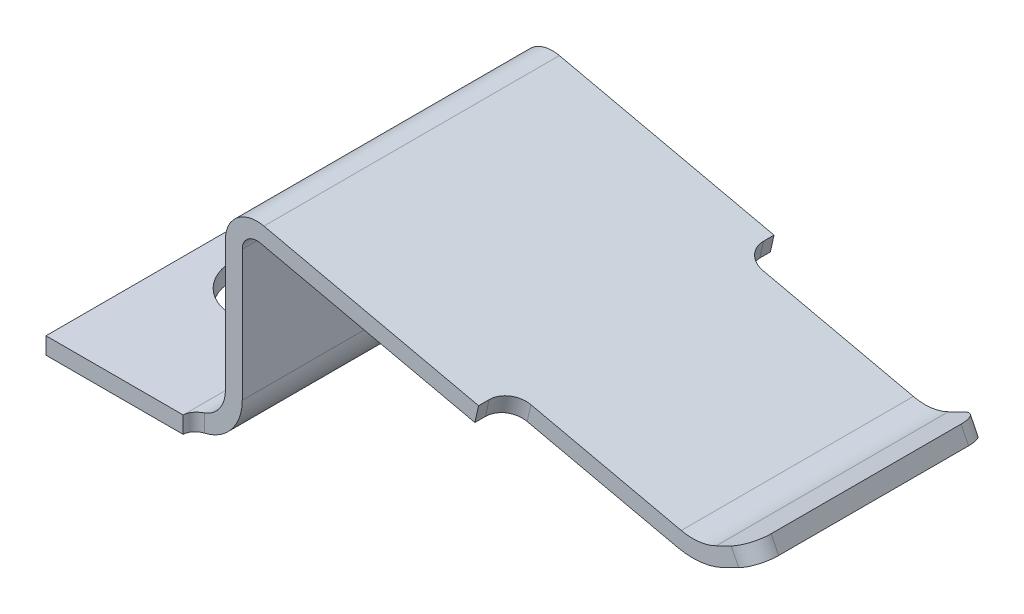
ISO-10303-21;
HEADER;
FILE_DESCRIPTION(('STEP AP214'),'2;1');
FILE_NAME('part.step','',(''),(''),'','','');
FILE_SCHEMA(('AUTOMOTIVE_DESIGN { 1 0 10303 214 1 1 1 1 }'));
ENDSEC;
DATA;
#1=APPLICATION_CONTEXT('core data for automotive mechanical design processes');
#2=APPLICATION_PROTOCOL_DEFINITION('international standard','automotive_design',2000,#1);
#3=PRODUCT_CONTEXT('',#1,'mechanical');
#4=PRODUCT('Part','Part','',(#3));
#5=PRODUCT_RELATED_PRODUCT_CATEGORY('part','',(#4));
#6=PRODUCT_DEFINITION_FORMATION('','',#4);
#7=PRODUCT_DEFINITION_CONTEXT('part definition',#1,'design');
#8=PRODUCT_DEFINITION('design','',#6,#7);
#9=PRODUCT_DEFINITION_SHAPE('','',#8);
#10=(LENGTH_UNIT() NAMED_UNIT(*) SI_UNIT(.MILLI.,.METRE.));
#11=(NAMED_UNIT(*) PLANE_ANGLE_UNIT() SI_UNIT($,.RADIAN.));
#12=(NAMED_UNIT(*) SI_UNIT($,.STERADIAN.) SOLID_ANGLE_UNIT());
#13=UNCERTAINTY_MEASURE_WITH_UNIT(LENGTH_MEASURE(1.E-05),#10,'distance_accuracy_value','');
#14=(GEOMETRIC_REPRESENTATION_CONTEXT(3) GLOBAL_UNCERTAINTY_ASSIGNED_CONTEXT((#13)) GLOBAL_UNIT_ASSIGNED_CONTEXT((#10,
#11,#12)) REPRESENTATION_CONTEXT('',''));
#15=CARTESIAN_POINT('',(0.,0.,0.));
#16=DIRECTION('',(0.,0.,1.));
#17=DIRECTION('',(1.,0.,0.));
#18=AXIS2_PLACEMENT_3D('',#15,#16,#17);
#19=CARTESIAN_POINT('',(-26.7290603518756,2.35941200013767,15.));
#20=DIRECTION('',(0.,0.,-1.));
#21=DIRECTION('',(-1.,0.,0.));
#22=AXIS2_PLACEMENT_3D('',#19,#20,#21);
#23=CYLINDRICAL_SURFACE('',#22,2.3);
#24=CARTESIAN_POINT('',(-26.7290603518756,2.35941200013767,14.5));
#25=DIRECTION('',(0.,0.,1.));
#26=DIRECTION('',(1.,0.,0.));
#27=AXIS2_PLACEMENT_3D('',#24,#25,#26);
#28=CIRCLE('',#27,2.3);
#29=CARTESIAN_POINT('',(-26.2290603518756,0.114417568073306,14.5));
#30=VERTEX_POINT('',#29);
#31=CARTESIAN_POINT('',(-24.4290603518756,2.35941200013769,14.5));
#32=VERTEX_POINT('',#31);
#33=EDGE_CURVE('E365',#30,#32,#28,.T.);
#34=ORIENTED_EDGE('',*,*,#33,.F.);
#35=CARTESIAN_POINT('',(-26.2290603518756,0.114417568073306,14.5));
#36=CARTESIAN_POINT('',(-26.2564473629787,0.108297891617995,14.499972232805));
#37=CARTESIAN_POINT('',(-26.2839607838795,0.10271583665332,14.5022492868127));
#38=CARTESIAN_POINT('',(-26.3384242806716,0.0926641254696684,14.5113343569761));
#39=CARTESIAN_POINT('',(-26.3653745851965,0.0881940094191474,14.5181404958789));
#40=CARTESIAN_POINT('',(-26.4179516690694,0.0803934619622615,14.5362161489702));
#41=CARTESIAN_POINT('',(-26.4435767983767,0.0770644236713034,14.5474910830679));
#42=CARTESIAN_POINT('',(-26.4926618015783,0.0714599061475847,14.5742132503489));
#43=CARTESIAN_POINT('',(-26.5161225799144,0.0691839852254791,14.5896587300463));
#44=CARTESIAN_POINT('',(-26.5598998306519,0.0655369479320075,14.6240858466973));
#45=CARTESIAN_POINT('',(-26.5802511168163,0.06415514980875,14.6430221270828));
#46=CARTESIAN_POINT('',(-26.6175574806604,0.0620402340923808,14.6840277856892));
#47=CARTESIAN_POINT('',(-26.6345115828421,0.0613073026147476,14.7060980607337));
#48=CARTESIAN_POINT('',(-26.6646099369819,0.0602654238021907,14.7528680668783));
#49=CARTESIAN_POINT('',(-26.6777339629093,0.059958696279143,14.7775808480982));
#50=CARTESIAN_POINT('',(-26.6996791714534,0.0595733693225185,14.8288439650459));
#51=CARTESIAN_POINT('',(-26.7085023777762,0.0594946625098046,14.8553934298126));
#52=CARTESIAN_POINT('',(-26.7197042817381,0.0594262458496021,14.9017114471902));
#53=CARTESIAN_POINT('',(-26.7232095864458,0.0594173548966498,14.9212153964667));
#54=CARTESIAN_POINT('',(-26.7278881134391,0.0594120054497062,14.9604770225969));
#55=CARTESIAN_POINT('',(-26.7290641463149,0.0594155319580244,14.980234364674));
#56=CARTESIAN_POINT('',(-26.7290603518756,0.0594120001376731,15.));
#57=B_SPLINE_CURVE_WITH_KNOTS('',3,(#35,#36,#37,#38,#39,#40,#41,#42,#43,#44,#45,#46,#47,#48,#49,
#50,#51,#52,#53,#54,#55,#56),.UNSPECIFIED.,.F.,.F.,(4,2,2,2,2,2,2,2,2,2,4),(0.,
0.0840988131780822,0.168162790073163,0.252329036190885,0.336459949964444,0.419566261057631,
0.502696401953614,0.586257909667654,0.669780060332771,0.729097682258264,0.788343685516884),.UNSPECIFIED.);
#58=CARTESIAN_POINT('',(-26.7290603518756,0.0594120001376729,15.));
#59=VERTEX_POINT('',#58);
#60=EDGE_CURVE('E256',#30,#59,#57,.T.);
#61=ORIENTED_EDGE('',*,*,#60,.T.);
#62=DIRECTION('',(0.,0.,-1.));
#63=VECTOR('',#62,1.);
#64=CARTESIAN_POINT('',(-26.7290603518756,0.0594120001376729,15.));
#65=LINE('',#64,#63);
#66=CARTESIAN_POINT('',(-26.7290603518756,0.0594120001376729,0.));
#67=VERTEX_POINT('',#66);
#68=EDGE_CURVE('E371',#59,#67,#65,.T.);
#69=ORIENTED_EDGE('',*,*,#68,.T.);
#70=CARTESIAN_POINT('',(-26.7290603518756,0.0594120001376729,0.));
#71=CARTESIAN_POINT('',(-26.7290842261194,0.0594266757004995,0.0281159383814194));
#72=CARTESIAN_POINT('',(-26.7266902568834,0.0594122466698722,0.056224881344144));
#73=CARTESIAN_POINT('',(-26.7172423187382,0.0594336371370751,0.111629111052852));
#74=CARTESIAN_POINT('',(-26.7101916202269,0.0594694213901872,0.138924954784363));
#75=CARTESIAN_POINT('',(-26.6916007534505,0.0596994707641535,0.19195838009901));
#76=CARTESIAN_POINT('',(-26.6800583139606,0.0598938161151774,0.217695165732216));
#77=CARTESIAN_POINT('',(-26.6528233691602,0.0606353695839836,0.266859505242131));
#78=CARTESIAN_POINT('',(-26.6371315669505,0.0611825179426022,0.290287449424877));
#79=CARTESIAN_POINT('',(-26.6020853240555,0.0628530076508338,0.334123271950187));
#80=CARTESIAN_POINT('',(-26.5827381969639,0.0639752059853017,0.354537038216604));
#81=CARTESIAN_POINT('',(-26.5409342512026,0.0670231258118374,0.391814672109207));
#82=CARTESIAN_POINT('',(-26.5184774356497,0.0689488464985527,0.408678543293349));
#83=CARTESIAN_POINT('',(-26.4713331946477,0.0737757534642002,0.438260573713225));
#84=CARTESIAN_POINT('',(-26.4466651923218,0.076668958005787,0.451011030229623));
#85=CARTESIAN_POINT('',(-26.3956931207944,0.083554743712414,0.472223208746983));
#86=CARTESIAN_POINT('',(-26.3693894827819,0.0875470360772381,0.480686055718539));
#87=CARTESIAN_POINT('',(-26.3239596712388,0.0952886684237955,0.491288398125929));
#88=CARTESIAN_POINT('',(-26.3050403506204,0.0987533994830042,0.494562186691906));
#89=CARTESIAN_POINT('',(-26.2670837089133,0.106201979117094,0.498918177314107));
#90=CARTESIAN_POINT('',(-26.2480466261751,0.110184984921513,0.500003891154771));
#91=CARTESIAN_POINT('',(-26.2290603518756,0.114417568073306,0.5));
#92=B_SPLINE_CURVE_WITH_KNOTS('',3,(#70,#71,#72,#73,#74,#75,#76,#77,#78,#79,#80,#81,#82,#83,#84,
#85,#86,#87,#88,#89,#90,#91),.UNSPECIFIED.,.F.,.F.,(4,2,2,2,2,2,2,2,2,2,4),(0.,
0.0842361075468874,0.1684131193119,0.25263275015259,0.336838119286433,0.420876760627213,
0.504915317738136,0.588276993082385,0.671616784889454,0.73002489537111,0.788339187956234),.UNSPECIFIED.);
#93=CARTESIAN_POINT('',(-26.2290603518756,0.114417568073306,0.5));
#94=VERTEX_POINT('',#93);
#95=EDGE_CURVE('E289',#67,#94,#92,.T.);
#96=ORIENTED_EDGE('',*,*,#95,.T.);
#97=CARTESIAN_POINT('',(-26.7290603518756,2.35941200013767,0.5));
#98=DIRECTION('',(0.,0.,-1.));
#99=DIRECTION('',(-1.,0.,0.));
#100=AXIS2_PLACEMENT_3D('',#97,#98,#99);
#101=CIRCLE('',#100,2.3);
#102=CARTESIAN_POINT('',(-24.4290603518756,2.35941200013769,0.5));
#103=VERTEX_POINT('',#102);
#104=EDGE_CURVE('E370',#103,#94,#101,.T.);
#105=ORIENTED_EDGE('',*,*,#104,.F.);
#106=DIRECTION('',(0.,0.,-1.));
#107=VECTOR('',#106,1.);
#108=CARTESIAN_POINT('',(-24.4290603518756,2.35941200013769,15.));
#109=LINE('',#108,#107);
#110=EDGE_CURVE('E360',#32,#103,#109,.T.);
#111=ORIENTED_EDGE('',*,*,#110,.F.);
#112=EDGE_LOOP('',(#34,#61,#69,#96,#105,#111));
#113=FACE_BOUND('',#112,.T.);
#114=ADVANCED_FACE('F33',(#113),#23,.T.);
#115=CARTESIAN_POINT('',(-24.4290603518756,2.35941200013769,15.));
#116=DIRECTION('',(-1.,0.,0.));
#117=DIRECTION('',(0.,0.,1.));
#118=AXIS2_PLACEMENT_3D('',#115,#116,#117);
#119=PLANE('',#118);
#120=DIRECTION('',(0.,1.,0.));
#121=VECTOR('',#120,1.);
#122=CARTESIAN_POINT('',(-24.4290603518756,2.35941200013769,14.5));
#123=LINE('',#122,#121);
#124=CARTESIAN_POINT('',(-24.4290603518756,8.55941200013767,14.5));
#125=VERTEX_POINT('',#124);
#126=EDGE_CURVE('E357',#32,#125,#123,.T.);
#127=ORIENTED_EDGE('',*,*,#126,.F.);
#128=ORIENTED_EDGE('',*,*,#110,.T.);
#129=DIRECTION('',(0.,-1.,0.));
#130=VECTOR('',#129,1.);
#131=CARTESIAN_POINT('',(-24.4290603518756,2.35941200013769,0.5));
#132=LINE('',#131,#130);
#133=CARTESIAN_POINT('',(-24.4290603518756,8.55941200013767,0.5));
#134=VERTEX_POINT('',#133);
#135=EDGE_CURVE('E413',#134,#103,#132,.T.);
#136=ORIENTED_EDGE('',*,*,#135,.F.);
#137=DIRECTION('',(0.,0.,-1.));
#138=VECTOR('',#137,1.);
#139=CARTESIAN_POINT('',(-24.4290603518756,8.55941200013767,15.));
#140=LINE('',#139,#138);
#141=EDGE_CURVE('E362',#125,#134,#140,.T.);
#142=ORIENTED_EDGE('',*,*,#141,.F.);
#143=EDGE_LOOP('',(#127,#128,#136,#142));
#144=FACE_BOUND('',#143,.T.);
#145=ADVANCED_FACE('F347',(#144),#119,.F.);
#146=CARTESIAN_POINT('',(-23.7290603518756,8.55941200013767,15.));
#147=DIRECTION('',(0.,0.,-1.));
#148=DIRECTION('',(-1.,0.,0.));
#149=AXIS2_PLACEMENT_3D('',#146,#147,#148);
#150=CYLINDRICAL_SURFACE('',#149,0.700000000000002);
#151=CARTESIAN_POINT('',(-23.7290603518756,8.55941200013767,14.5));
#152=DIRECTION('',(0.,0.,1.));
#153=DIRECTION('',(1.,0.,0.));
#154=AXIS2_PLACEMENT_3D('',#151,#152,#153);
#155=CIRCLE('',#154,0.700000000000002);
#156=CARTESIAN_POINT('',(-23.5757141356482,9.24240902646265,14.5));
#157=VERTEX_POINT('',#156);
#158=EDGE_CURVE('E366',#125,#157,#155,.F.);
#159=ORIENTED_EDGE('',*,*,#158,.F.);
#160=ORIENTED_EDGE('',*,*,#141,.T.);
#161=CARTESIAN_POINT('',(-23.7290603518756,8.55941200013767,0.5));
#162=DIRECTION('',(0.,0.,-1.));
#163=DIRECTION('',(-1.,0.,0.));
#164=AXIS2_PLACEMENT_3D('',#161,#162,#163);
#165=CIRCLE('',#164,0.700000000000002);
#166=CARTESIAN_POINT('',(-23.5757141356482,9.24240902646265,0.5));
#167=VERTEX_POINT('',#166);
#168=EDGE_CURVE('E410',#167,#134,#165,.F.);
#169=ORIENTED_EDGE('',*,*,#168,.F.);
#170=DIRECTION('',(0.,0.,-1.));
#171=VECTOR('',#170,1.);
#172=CARTESIAN_POINT('',(-23.5757141356482,9.24240902646265,15.));
#173=LINE('',#172,#171);
#174=EDGE_CURVE('E375',#157,#167,#173,.T.);
#175=ORIENTED_EDGE('',*,*,#174,.F.);
#176=EDGE_LOOP('',(#159,#160,#169,#175));
#177=FACE_BOUND('',#176,.T.);
#178=ADVANCED_FACE('F345',(#177),#150,.F.);
#179=CARTESIAN_POINT('',(-23.5757141356482,9.24240902646265,15.));
#180=DIRECTION('',(0.219066023181931,0.975710037607103,0.));
#181=DIRECTION('',(-0.975710037607103,0.219066023181931,0.));
#182=AXIS2_PLACEMENT_3D('',#179,#180,#181);
#183=PLANE('',#182);
#184=DIRECTION('',(-0.975710037607103,0.219066023181931,0.));
#185=VECTOR('',#184,1.);
#186=CARTESIAN_POINT('',(-23.5757141356482,9.24240902646265,0.5));
#187=LINE('',#186,#185);
#188=CARTESIAN_POINT('',(-13.4043131704211,6.95873019386011,0.5));
#189=VERTEX_POINT('',#188);
#190=EDGE_CURVE('E227',#189,#167,#187,.T.);
#191=ORIENTED_EDGE('',*,*,#190,.F.);
#192=DIRECTION('',(0.,0.,-1.));
#193=VECTOR('',#192,1.);
#194=CARTESIAN_POINT('',(-13.4043131704211,6.95873019386012,2.83843624783257));
#195=LINE('',#194,#193);
#196=CARTESIAN_POINT('',(-13.4043131704211,6.95873019386012,1.));
#197=VERTEX_POINT('',#196);
#198=EDGE_CURVE('E213',#197,#189,#195,.T.);
#199=ORIENTED_EDGE('',*,*,#198,.F.);
#200=CARTESIAN_POINT('',(-12.428603132814,6.73966417067818,1.));
#201=DIRECTION('',(0.219066023181931,0.975710037607103,0.));
#202=DIRECTION('',(-0.975710037607103,0.219066023181931,0.));
#203=AXIS2_PLACEMENT_3D('',#200,#201,#202);
#204=CIRCLE('',#203,1.);
#205=CARTESIAN_POINT('',(-12.428603132814,6.73966417067818,2.));
#206=VERTEX_POINT('',#205);
#207=EDGE_CURVE('E725',#197,#206,#204,.T.);
#208=ORIENTED_EDGE('',*,*,#207,.T.);
#209=DIRECTION('',(-0.975710037607103,0.219066023181931,0.));
#210=VECTOR('',#209,1.);
#211=CARTESIAN_POINT('',(-23.5757141356482,9.24240902646265,2.));
#212=LINE('',#211,#210);
#213=CARTESIAN_POINT('',(-5.30185194869539,5.13956887603424,2.));
#214=VERTEX_POINT('',#213);
#215=EDGE_CURVE('E386',#214,#206,#212,.T.);
#216=ORIENTED_EDGE('',*,*,#215,.F.);
#217=DIRECTION('',(0.,0.,-1.));
#218=VECTOR('',#217,1.);
#219=CARTESIAN_POINT('',(-5.30185194869539,5.13956887603424,15.));
#220=LINE('',#219,#218);
#221=CARTESIAN_POINT('',(-5.30185194869539,5.13956887603424,13.));
#222=VERTEX_POINT('',#221);
#223=EDGE_CURVE('E468',#222,#214,#220,.T.);
#224=ORIENTED_EDGE('',*,*,#223,.F.);
#225=DIRECTION('',(0.975710037607103,-0.219066023181931,0.));
#226=VECTOR('',#225,1.);
#227=CARTESIAN_POINT('',(-23.5757141356482,9.24240902646265,13.));
#228=LINE('',#227,#226);
#229=CARTESIAN_POINT('',(-12.428603132814,6.73966417067818,13.));
#230=VERTEX_POINT('',#229);
#231=EDGE_CURVE('E402',#230,#222,#228,.T.);
#232=ORIENTED_EDGE('',*,*,#231,.F.);
#233=CARTESIAN_POINT('',(-12.428603132814,6.73966417067818,14.));
#234=DIRECTION('',(0.219066023181931,0.975710037607103,0.));
#235=DIRECTION('',(-0.975710037607103,0.219066023181931,0.));
#236=AXIS2_PLACEMENT_3D('',#233,#234,#235);
#237=CIRCLE('',#236,1.);
#238=CARTESIAN_POINT('',(-13.4043131704211,6.95873019386012,14.));
#239=VERTEX_POINT('',#238);
#240=EDGE_CURVE('E11',#230,#239,#237,.T.);
#241=ORIENTED_EDGE('',*,*,#240,.T.);
#242=DIRECTION('',(0.,0.,1.));
#243=VECTOR('',#242,1.);
#244=CARTESIAN_POINT('',(-13.4043131704211,6.95873019386012,12.1615637521674));
#245=LINE('',#244,#243);
#246=CARTESIAN_POINT('',(-13.4043131704211,6.95873019386012,14.5));
#247=VERTEX_POINT('',#246);
#248=EDGE_CURVE('E784',#239,#247,#245,.T.);
#249=ORIENTED_EDGE('',*,*,#248,.T.);
#250=DIRECTION('',(0.975710037607103,-0.219066023181931,0.));
#251=VECTOR('',#250,1.);
#252=CARTESIAN_POINT('',(-23.5757141356482,9.24240902646265,14.5));
#253=LINE('',#252,#251);
#254=EDGE_CURVE('E474',#157,#247,#253,.T.);
#255=ORIENTED_EDGE('',*,*,#254,.F.);
#256=ORIENTED_EDGE('',*,*,#174,.T.);
#257=EDGE_LOOP('',(#191,#199,#208,#216,#224,#232,#241,#249,#255,#256));
#258=FACE_BOUND('',#257,.T.);
#259=ADVANCED_FACE('F341',(#258),#183,.F.);
#260=CARTESIAN_POINT('',(-4.57893407219502,8.35941200013767,15.));
#261=DIRECTION('',(0.,0.,-1.));
#262=DIRECTION('',(-1.,0.,0.));
#263=AXIS2_PLACEMENT_3D('',#260,#261,#262);
#264=CYLINDRICAL_SURFACE('',#263,3.3);
#265=CARTESIAN_POINT('',(-4.57893407219502,8.35941200013767,13.));
#266=DIRECTION('',(0.,0.,1.));
#267=DIRECTION('',(1.,0.,0.));
#268=AXIS2_PLACEMENT_3D('',#265,#266,#267);
#269=CIRCLE('',#268,3.3);
#270=CARTESIAN_POINT('',(-3.1111062565973,5.40382720119219,13.));
#271=VERTEX_POINT('',#270);
#272=EDGE_CURVE('E405',#222,#271,#269,.T.);
#273=ORIENTED_EDGE('',*,*,#272,.F.);
#274=ORIENTED_EDGE('',*,*,#223,.T.);
#275=CARTESIAN_POINT('',(-4.57893407219502,8.35941200013767,2.));
#276=DIRECTION('',(0.,0.,-1.));
#277=DIRECTION('',(-1.,0.,0.));
#278=AXIS2_PLACEMENT_3D('',#275,#276,#277);
#279=CIRCLE('',#278,3.3);
#280=CARTESIAN_POINT('',(-3.1111062565973,5.40382720119219,2.));
#281=VERTEX_POINT('',#280);
#282=EDGE_CURVE('E424',#281,#214,#279,.T.);
#283=ORIENTED_EDGE('',*,*,#282,.F.);
#284=DIRECTION('',(0.,0.,-1.));
#285=VECTOR('',#284,1.);
#286=CARTESIAN_POINT('',(-3.1111062565973,5.40382720119219,15.));
#287=LINE('',#286,#285);
#288=EDGE_CURVE('E465',#271,#281,#287,.T.);
#289=ORIENTED_EDGE('',*,*,#288,.F.);
#290=EDGE_LOOP('',(#273,#274,#283,#289));
#291=FACE_BOUND('',#290,.T.);
#292=ADVANCED_FACE('F337',(#291),#264,.T.);
#293=CARTESIAN_POINT('',(-3.1111062565973,5.40382720119219,15.));
#294=DIRECTION('',(-0.444796307756886,0.895631757256207,0.));
#295=DIRECTION('',(-0.895631757256207,-0.444796307756886,0.));
#296=AXIS2_PLACEMENT_3D('',#293,#294,#295);
#297=PLANE('',#296);
#298=DIRECTION('',(0.,0.,-1.));
#299=VECTOR('',#298,1.);
#300=CARTESIAN_POINT('',(-1.51062787736964,6.19867047015585,15.));
#301=LINE('',#300,#299);
#302=CARTESIAN_POINT('',(-1.51062787736964,6.19867047015585,12.));
#303=VERTEX_POINT('',#302);
#304=CARTESIAN_POINT('',(-1.51062787736964,6.19867047015585,3.));
#305=VERTEX_POINT('',#304);
#306=EDGE_CURVE('E462',#303,#305,#301,.T.);
#307=ORIENTED_EDGE('',*,*,#306,.F.);
#308=CARTESIAN_POINT('',(-2.40625963462585,5.75387416239896,12.));
#309=DIRECTION('',(-0.444796307756886,0.895631757256207,0.));
#310=DIRECTION('',(-0.895631757256207,-0.444796307756886,0.));
#311=AXIS2_PLACEMENT_3D('',#308,#309,#310);
#312=CIRCLE('',#311,1.);
#313=CARTESIAN_POINT('',(-2.40625963462585,5.75387416239896,13.));
#314=VERTEX_POINT('',#313);
#315=EDGE_CURVE('E756',#303,#314,#312,.F.);
#316=ORIENTED_EDGE('',*,*,#315,.T.);
#317=DIRECTION('',(0.895631757256207,0.444796307756886,0.));
#318=VECTOR('',#317,1.);
#319=CARTESIAN_POINT('',(-3.1111062565973,5.40382720119219,13.));
#320=LINE('',#319,#318);
#321=EDGE_CURVE('E743',#271,#314,#320,.T.);
#322=ORIENTED_EDGE('',*,*,#321,.F.);
#323=ORIENTED_EDGE('',*,*,#288,.T.);
#324=DIRECTION('',(-0.895631757256207,-0.444796307756886,0.));
#325=VECTOR('',#324,1.);
#326=CARTESIAN_POINT('',(-3.1111062565973,5.40382720119219,2.));
#327=LINE('',#326,#325);
#328=CARTESIAN_POINT('',(-2.40625963462585,5.75387416239896,2.));
#329=VERTEX_POINT('',#328);
#330=EDGE_CURVE('E422',#329,#281,#327,.T.);
#331=ORIENTED_EDGE('',*,*,#330,.F.);
#332=CARTESIAN_POINT('',(-2.40625963462585,5.75387416239896,3.));
#333=DIRECTION('',(-0.444796307756886,0.895631757256207,0.));
#334=DIRECTION('',(-0.895631757256207,-0.444796307756886,0.));
#335=AXIS2_PLACEMENT_3D('',#332,#333,#334);
#336=CIRCLE('',#335,1.);
#337=EDGE_CURVE('E762',#329,#305,#336,.F.);
#338=ORIENTED_EDGE('',*,*,#337,.T.);
#339=EDGE_LOOP('',(#307,#316,#322,#323,#331,#338));
#340=FACE_BOUND('',#339,.T.);
#341=ADVANCED_FACE('F333',(#340),#297,.F.);
#342=CARTESIAN_POINT('',(-1.86646492357515,6.91517587596081,15.));
#343=DIRECTION('',(-0.895631757256207,-0.444796307756886,0.));
#344=DIRECTION('',(0.444796307756886,-0.895631757256207,0.));
#345=AXIS2_PLACEMENT_3D('',#342,#343,#344);
#346=PLANE('',#345);
#347=DIRECTION('',(0.,0.,-1.));
#348=VECTOR('',#347,1.);
#349=CARTESIAN_POINT('',(-1.86646492357515,6.91517587596081,15.));
#350=LINE('',#349,#348);
#351=CARTESIAN_POINT('',(-1.86646492357515,6.91517587596081,12.));
#352=VERTEX_POINT('',#351);
#353=CARTESIAN_POINT('',(-1.86646492357515,6.91517587596081,3.));
#354=VERTEX_POINT('',#353);
#355=EDGE_CURVE('E459',#352,#354,#350,.T.);
#356=ORIENTED_EDGE('',*,*,#355,.F.);
#357=DIRECTION('',(-0.444796307756886,0.895631757256207,0.));
#358=VECTOR('',#357,1.);
#359=CARTESIAN_POINT('',(-1.51062787736964,6.19867047015585,12.));
#360=LINE('',#359,#358);
#361=EDGE_CURVE('E766',#352,#303,#360,.F.);
#362=ORIENTED_EDGE('',*,*,#361,.T.);
#363=ORIENTED_EDGE('',*,*,#306,.T.);
#364=DIRECTION('',(0.444796307756886,-0.895631757256207,0.));
#365=VECTOR('',#364,1.);
#366=CARTESIAN_POINT('',(-1.86646492357515,6.91517587596081,3.));
#367=LINE('',#366,#365);
#368=EDGE_CURVE('E768',#305,#354,#367,.F.);
#369=ORIENTED_EDGE('',*,*,#368,.T.);
#370=EDGE_LOOP('',(#356,#362,#363,#369));
#371=FACE_BOUND('',#370,.T.);
#372=ADVANCED_FACE('F329',(#371),#346,.F.);
#373=CARTESIAN_POINT('',(-3.46694330280281,6.12033260699716,15.));
#374=DIRECTION('',(0.444796307756886,-0.895631757256207,0.));
#375=DIRECTION('',(0.895631757256207,0.444796307756886,0.));
#376=AXIS2_PLACEMENT_3D('',#373,#374,#375);
#377=PLANE('',#376);
#378=DIRECTION('',(-0.895631757256207,-0.444796307756886,0.));
#379=VECTOR('',#378,1.);
#380=CARTESIAN_POINT('',(-3.46694330280281,6.12033260699716,13.));
#381=LINE('',#380,#379);
#382=CARTESIAN_POINT('',(-2.76209668083136,6.47037956820393,13.));
#383=VERTEX_POINT('',#382);
#384=CARTESIAN_POINT('',(-3.46694330280281,6.12033260699716,13.));
#385=VERTEX_POINT('',#384);
#386=EDGE_CURVE('E740',#383,#385,#381,.T.);
#387=ORIENTED_EDGE('',*,*,#386,.F.);
#388=CARTESIAN_POINT('',(-2.76209668083136,6.47037956820393,12.));
#389=DIRECTION('',(0.444796307756886,-0.895631757256207,0.));
#390=DIRECTION('',(0.895631757256207,0.444796307756886,0.));
#391=AXIS2_PLACEMENT_3D('',#388,#389,#390);
#392=CIRCLE('',#391,1.);
#393=EDGE_CURVE('E770',#383,#352,#392,.F.);
#394=ORIENTED_EDGE('',*,*,#393,.T.);
#395=ORIENTED_EDGE('',*,*,#355,.T.);
#396=CARTESIAN_POINT('',(-2.76209668083136,6.47037956820393,3.));
#397=DIRECTION('',(0.444796307756886,-0.895631757256207,0.));
#398=DIRECTION('',(0.895631757256207,0.444796307756886,0.));
#399=AXIS2_PLACEMENT_3D('',#396,#397,#398);
#400=CIRCLE('',#399,1.);
#401=CARTESIAN_POINT('',(-2.76209668083136,6.47037956820393,2.));
#402=VERTEX_POINT('',#401);
#403=EDGE_CURVE('E772',#354,#402,#400,.F.);
#404=ORIENTED_EDGE('',*,*,#403,.T.);
#405=DIRECTION('',(0.895631757256207,0.444796307756886,0.));
#406=VECTOR('',#405,1.);
#407=CARTESIAN_POINT('',(-3.46694330280281,6.12033260699716,2.));
#408=LINE('',#407,#406);
#409=CARTESIAN_POINT('',(-3.46694330280281,6.12033260699716,2.));
#410=VERTEX_POINT('',#409);
#411=EDGE_CURVE('E419',#410,#402,#408,.T.);
#412=ORIENTED_EDGE('',*,*,#411,.F.);
#413=DIRECTION('',(0.,0.,-1.));
#414=VECTOR('',#413,1.);
#415=CARTESIAN_POINT('',(-3.46694330280281,6.12033260699716,15.));
#416=LINE('',#415,#414);
#417=EDGE_CURVE('E457',#385,#410,#416,.T.);
#418=ORIENTED_EDGE('',*,*,#417,.F.);
#419=EDGE_LOOP('',(#387,#394,#395,#404,#412,#418));
#420=FACE_BOUND('',#419,.T.);
#421=ADVANCED_FACE('F325',(#420),#377,.F.);
#422=CARTESIAN_POINT('',(-4.57893407219502,8.35941200013767,15.));
#423=DIRECTION('',(0.,0.,-1.));
#424=DIRECTION('',(-1.,0.,0.));
#425=AXIS2_PLACEMENT_3D('',#422,#423,#424);
#426=CYLINDRICAL_SURFACE('',#425,2.5);
#427=CARTESIAN_POINT('',(-4.57893407219502,8.35941200013767,13.));
#428=DIRECTION('',(0.,0.,1.));
#429=DIRECTION('',(1.,0.,0.));
#430=AXIS2_PLACEMENT_3D('',#427,#428,#429);
#431=CIRCLE('',#430,2.5);
#432=CARTESIAN_POINT('',(-5.12659913014985,5.92013690611992,13.));
#433=VERTEX_POINT('',#432);
#434=EDGE_CURVE('E737',#385,#433,#431,.F.);
#435=ORIENTED_EDGE('',*,*,#434,.F.);
#436=ORIENTED_EDGE('',*,*,#417,.T.);
#437=CARTESIAN_POINT('',(-4.57893407219502,8.35941200013767,2.));
#438=DIRECTION('',(0.,0.,-1.));
#439=DIRECTION('',(-1.,0.,0.));
#440=AXIS2_PLACEMENT_3D('',#437,#438,#439);
#441=CIRCLE('',#440,2.5);
#442=CARTESIAN_POINT('',(-5.12659913014985,5.92013690611992,2.));
#443=VERTEX_POINT('',#442);
#444=EDGE_CURVE('E416',#443,#410,#441,.F.);
#445=ORIENTED_EDGE('',*,*,#444,.F.);
#446=DIRECTION('',(0.,0.,-1.));
#447=VECTOR('',#446,1.);
#448=CARTESIAN_POINT('',(-5.12659913014985,5.92013690611992,15.));
#449=LINE('',#448,#447);
#450=EDGE_CURVE('E454',#433,#443,#449,.T.);
#451=ORIENTED_EDGE('',*,*,#450,.F.);
#452=EDGE_LOOP('',(#435,#436,#445,#451));
#453=FACE_BOUND('',#452,.T.);
#454=ADVANCED_FACE('F322',(#453),#426,.F.);
#455=CARTESIAN_POINT('',(-23.4004613171027,10.0229770565483,15.));
#456=DIRECTION('',(-0.219066023181932,-0.975710037607103,0.));
#457=DIRECTION('',(0.975710037607103,-0.219066023181932,0.));
#458=AXIS2_PLACEMENT_3D('',#455,#456,#457);
#459=PLANE('',#458);
#460=DIRECTION('',(-0.975710037607103,0.219066023181932,0.));
#461=VECTOR('',#460,1.);
#462=CARTESIAN_POINT('',(-23.4004613171027,10.0229770565483,13.));
#463=LINE('',#462,#461);
#464=CARTESIAN_POINT('',(-12.2533503142685,7.52023220076386,13.));
#465=VERTEX_POINT('',#464);
#466=EDGE_CURVE('E248',#433,#465,#463,.T.);
#467=ORIENTED_EDGE('',*,*,#466,.F.);
#468=ORIENTED_EDGE('',*,*,#450,.T.);
#469=DIRECTION('',(0.975710037607103,-0.219066023181932,0.));
#470=VECTOR('',#469,1.);
#471=CARTESIAN_POINT('',(-23.4004613171027,10.0229770565483,2.));
#472=LINE('',#471,#470);
#473=CARTESIAN_POINT('',(-12.2533503142685,7.52023220076386,2.));
#474=VERTEX_POINT('',#473);
#475=EDGE_CURVE('E235',#474,#443,#472,.T.);
#476=ORIENTED_EDGE('',*,*,#475,.F.);
#477=CARTESIAN_POINT('',(-12.2533503142685,7.52023220076386,1.));
#478=DIRECTION('',(-0.219066023181932,-0.975710037607103,0.));
#479=DIRECTION('',(0.975710037607103,-0.219066023181932,0.));
#480=AXIS2_PLACEMENT_3D('',#477,#478,#479);
#481=CIRCLE('',#480,1.);
#482=CARTESIAN_POINT('',(-13.2290603518756,7.7392982239458,1.));
#483=VERTEX_POINT('',#482);
#484=EDGE_CURVE('E233',#474,#483,#481,.T.);
#485=ORIENTED_EDGE('',*,*,#484,.T.);
#486=DIRECTION('',(0.,0.,1.));
#487=VECTOR('',#486,1.);
#488=CARTESIAN_POINT('',(-13.2290603518756,7.7392982239458,15.));
#489=LINE('',#488,#487);
#490=CARTESIAN_POINT('',(-13.2290603518756,7.7392982239458,0.5));
#491=VERTEX_POINT('',#490);
#492=EDGE_CURVE('E210',#491,#483,#489,.T.);
#493=ORIENTED_EDGE('',*,*,#492,.F.);
#494=DIRECTION('',(0.975710037607103,-0.219066023181932,0.));
#495=VECTOR('',#494,1.);
#496=CARTESIAN_POINT('',(-23.4004613171027,10.0229770565483,0.5));
#497=LINE('',#496,#495);
#498=CARTESIAN_POINT('',(-23.4004613171027,10.0229770565483,0.5));
#499=VERTEX_POINT('',#498);
#500=EDGE_CURVE('E219',#499,#491,#497,.T.);
#501=ORIENTED_EDGE('',*,*,#500,.F.);
#502=DIRECTION('',(0.,0.,-1.));
#503=VECTOR('',#502,1.);
#504=CARTESIAN_POINT('',(-23.4004613171027,10.0229770565483,15.));
#505=LINE('',#504,#503);
#506=CARTESIAN_POINT('',(-23.4004613171027,10.0229770565483,14.5));
#507=VERTEX_POINT('',#506);
#508=EDGE_CURVE('E452',#507,#499,#505,.T.);
#509=ORIENTED_EDGE('',*,*,#508,.F.);
#510=DIRECTION('',(-0.975710037607103,0.219066023181932,0.));
#511=VECTOR('',#510,1.);
#512=CARTESIAN_POINT('',(-23.4004613171027,10.0229770565483,14.5));
#513=LINE('',#512,#511);
#514=CARTESIAN_POINT('',(-13.2290603518756,7.7392982239458,14.5));
#515=VERTEX_POINT('',#514);
#516=EDGE_CURVE('E792',#515,#507,#513,.T.);
#517=ORIENTED_EDGE('',*,*,#516,.F.);
#518=DIRECTION('',(0.,0.,1.));
#519=VECTOR('',#518,1.);
#520=CARTESIAN_POINT('',(-13.2290603518756,7.7392982239458,15.));
#521=LINE('',#520,#519);
#522=CARTESIAN_POINT('',(-13.2290603518756,7.7392982239458,14.));
#523=VERTEX_POINT('',#522);
#524=EDGE_CURVE('E246',#523,#515,#521,.T.);
#525=ORIENTED_EDGE('',*,*,#524,.F.);
#526=CARTESIAN_POINT('',(-12.2533503142685,7.52023220076387,14.));
#527=DIRECTION('',(-0.219066023181932,-0.975710037607103,0.));
#528=DIRECTION('',(0.975710037607103,-0.219066023181932,0.));
#529=AXIS2_PLACEMENT_3D('',#526,#527,#528);
#530=CIRCLE('',#529,1.);
#531=EDGE_CURVE('E41',#523,#465,#530,.T.);
#532=ORIENTED_EDGE('',*,*,#531,.T.);
#533=EDGE_LOOP('',(#467,#468,#476,#485,#493,#501,#509,#517,#525,#532));
#534=FACE_BOUND('',#533,.T.);
#535=ADVANCED_FACE('F230',(#534),#459,.F.);
#536=CARTESIAN_POINT('',(-23.7290603518756,8.55941200013767,15.));
#537=DIRECTION('',(0.,0.,-1.));
#538=DIRECTION('',(-1.,0.,0.));
#539=AXIS2_PLACEMENT_3D('',#536,#537,#538);
#540=CYLINDRICAL_SURFACE('',#539,1.5);
#541=CARTESIAN_POINT('',(-23.7290603518756,8.55941200013767,14.5));
#542=DIRECTION('',(0.,0.,1.));
#543=DIRECTION('',(1.,0.,0.));
#544=AXIS2_PLACEMENT_3D('',#541,#542,#543);
#545=CIRCLE('',#544,1.5);
#546=CARTESIAN_POINT('',(-25.2290603518756,8.55941200013767,14.5));
#547=VERTEX_POINT('',#546);
#548=EDGE_CURVE('E790',#507,#547,#545,.T.);
#549=ORIENTED_EDGE('',*,*,#548,.F.);
#550=ORIENTED_EDGE('',*,*,#508,.T.);
#551=CARTESIAN_POINT('',(-23.7290603518756,8.55941200013767,0.5));
#552=DIRECTION('',(0.,0.,-1.));
#553=DIRECTION('',(-1.,0.,0.));
#554=AXIS2_PLACEMENT_3D('',#551,#552,#553);
#555=CIRCLE('',#554,1.5);
#556=CARTESIAN_POINT('',(-25.2290603518756,8.55941200013767,0.5));
#557=VERTEX_POINT('',#556);
#558=EDGE_CURVE('E224',#557,#499,#555,.T.);
#559=ORIENTED_EDGE('',*,*,#558,.F.);
#560=DIRECTION('',(0.,0.,-1.));
#561=VECTOR('',#560,1.);
#562=CARTESIAN_POINT('',(-25.2290603518756,8.55941200013767,15.));
#563=LINE('',#562,#561);
#564=EDGE_CURVE('E398',#547,#557,#563,.T.);
#565=ORIENTED_EDGE('',*,*,#564,.F.);
#566=EDGE_LOOP('',(#549,#550,#559,#565));
#567=FACE_BOUND('',#566,.T.);
#568=ADVANCED_FACE('F315',(#567),#540,.T.);
#569=CARTESIAN_POINT('',(-25.2290603518756,2.35941200013768,15.));
#570=DIRECTION('',(1.,0.,0.));
#571=DIRECTION('',(0.,0.,-1.));
#572=AXIS2_PLACEMENT_3D('',#569,#570,#571);
#573=PLANE('',#572);
#574=DIRECTION('',(0.,-1.,0.));
#575=VECTOR('',#574,1.);
#576=CARTESIAN_POINT('',(-25.2290603518756,2.35941200013768,14.5));
#577=LINE('',#576,#575);
#578=CARTESIAN_POINT('',(-25.2290603518756,2.35941200013767,14.5));
#579=VERTEX_POINT('',#578);
#580=EDGE_CURVE('E788',#547,#579,#577,.T.);
#581=ORIENTED_EDGE('',*,*,#580,.F.);
#582=ORIENTED_EDGE('',*,*,#564,.T.);
#583=DIRECTION('',(0.,1.,0.));
#584=VECTOR('',#583,1.);
#585=CARTESIAN_POINT('',(-25.2290603518756,2.35941200013768,0.5));
#586=LINE('',#585,#584);
#587=CARTESIAN_POINT('',(-25.2290603518756,2.35941200013768,0.5));
#588=VERTEX_POINT('',#587);
#589=EDGE_CURVE('E391',#588,#557,#586,.T.);
#590=ORIENTED_EDGE('',*,*,#589,.F.);
#591=DIRECTION('',(0.,0.,-1.));
#592=VECTOR('',#591,1.);
#593=CARTESIAN_POINT('',(-25.2290603518756,2.35941200013768,15.));
#594=LINE('',#593,#592);
#595=EDGE_CURVE('E396',#579,#588,#594,.T.);
#596=ORIENTED_EDGE('',*,*,#595,.F.);
#597=EDGE_LOOP('',(#581,#582,#590,#596));
#598=FACE_BOUND('',#597,.T.);
#599=ADVANCED_FACE('F308',(#598),#573,.F.);
#600=CARTESIAN_POINT('',(-26.7290603518756,2.35941200013767,15.));
#601=DIRECTION('',(0.,0.,-1.));
#602=DIRECTION('',(-1.,0.,0.));
#603=AXIS2_PLACEMENT_3D('',#600,#601,#602);
#604=CYLINDRICAL_SURFACE('',#603,1.5);
#605=CARTESIAN_POINT('',(-26.7290603518756,2.35941200013767,14.5));
#606=DIRECTION('',(0.,0.,1.));
#607=DIRECTION('',(1.,0.,0.));
#608=AXIS2_PLACEMENT_3D('',#605,#606,#607);
#609=CIRCLE('',#608,1.5);
#610=CARTESIAN_POINT('',(-26.2290603518756,0.945198437764574,14.5));
#611=VERTEX_POINT('',#610);
#612=EDGE_CURVE('E238',#579,#611,#609,.F.);
#613=ORIENTED_EDGE('',*,*,#612,.F.);
#614=ORIENTED_EDGE('',*,*,#595,.T.);
#615=CARTESIAN_POINT('',(-26.7290603518756,2.35941200013767,0.5));
#616=DIRECTION('',(0.,0.,-1.));
#617=DIRECTION('',(-1.,0.,0.));
#618=AXIS2_PLACEMENT_3D('',#615,#616,#617);
#619=CIRCLE('',#618,1.5);
#620=CARTESIAN_POINT('',(-26.2290603518756,0.945198437764574,0.5));
#621=VERTEX_POINT('',#620);
#622=EDGE_CURVE('E240',#621,#588,#619,.F.);
#623=ORIENTED_EDGE('',*,*,#622,.F.);
#624=CARTESIAN_POINT('',(-26.2290603518756,0.945198437764574,0.5));
#625=CARTESIAN_POINT('',(-26.255426133445,0.93584554741347,0.500031492791937));
#626=CARTESIAN_POINT('',(-26.2820938298137,0.927277369165034,0.497914731400896));
#627=CARTESIAN_POINT('',(-26.3352071393953,0.911785847937718,0.48933480196967));
#628=CARTESIAN_POINT('',(-26.3616527252167,0.904862705040145,0.482871105589092));
#629=CARTESIAN_POINT('',(-26.4135450040221,0.892725898669032,0.465528688811864));
#630=CARTESIAN_POINT('',(-26.4389894188759,0.887515955498208,0.454640473403516));
#631=CARTESIAN_POINT('',(-26.4879187095095,0.878713725854097,0.428670543344186));
#632=CARTESIAN_POINT('',(-26.5114050592316,0.875120213482907,0.413592020702796));
#633=CARTESIAN_POINT('',(-26.5550201049263,0.869384553780058,0.380112120747817));
#634=CARTESIAN_POINT('',(-26.5752241935054,0.867204712987079,0.361815180371502));
#635=CARTESIAN_POINT('',(-26.6124335752321,0.863835861143578,0.322126097036097));
#636=CARTESIAN_POINT('',(-26.6294375717845,0.86264725104789,0.300732705658602));
#637=CARTESIAN_POINT('',(-26.6599051554545,0.860928171805605,0.255207970902027));
#638=CARTESIAN_POINT('',(-26.6733293983053,0.860404795925269,0.231050064435361));
#639=CARTESIAN_POINT('',(-26.6960185369299,0.859732924155157,0.180853969106585));
#640=CARTESIAN_POINT('',(-26.7052847529281,0.859584309204854,0.154816380119291));
#641=CARTESIAN_POINT('',(-26.717888822438,0.859442970252665,0.107305315186166));
#642=CARTESIAN_POINT('',(-26.7220722564561,0.859423631877105,0.0860518071749978));
#643=CARTESIAN_POINT('',(-26.7276600785477,0.859412094122604,0.043201318003399));
#644=CARTESIAN_POINT('',(-26.729066848884,0.859419871463635,0.0216046473152479));
#645=CARTESIAN_POINT('',(-26.7290603518756,0.859412000137673,0.));
#646=B_SPLINE_CURVE_WITH_KNOTS('',3,(#624,#625,#626,#627,#628,#629,#630,#631,#632,#633,#634,
#635,#636,#637,#638,#639,#640,#641,#642,#643,#644,#645),.UNSPECIFIED.,.F.,.F.,(4,2,2,2,2,2,2,2,
2,2,4),(0.,0.0838673627265125,0.167744920803443,0.251803438682492,0.335798098819957,
0.417449468919119,0.499133851165317,0.581682105851863,0.664204131876433,0.729013020677861,
0.793766281918105),.UNSPECIFIED.);
#647=CARTESIAN_POINT('',(-26.7290603518756,0.859412000137673,0.));
#648=VERTEX_POINT('',#647);
#649=EDGE_CURVE('E294',#621,#648,#646,.T.);
#650=ORIENTED_EDGE('',*,*,#649,.T.);
#651=DIRECTION('',(0.,0.,-1.));
#652=VECTOR('',#651,1.);
#653=CARTESIAN_POINT('',(-26.7290603518756,0.859412000137673,15.));
#654=LINE('',#653,#652);
#655=CARTESIAN_POINT('',(-26.7290603518756,0.859412000137673,15.));
#656=VERTEX_POINT('',#655);
#657=EDGE_CURVE('E399',#656,#648,#654,.T.);
#658=ORIENTED_EDGE('',*,*,#657,.F.);
#659=CARTESIAN_POINT('',(-26.7290603518756,0.859412000137673,15.));
#660=CARTESIAN_POINT('',(-26.7290842041047,0.859434454932969,14.9719019414292));
#661=CARTESIAN_POINT('',(-26.7266932643872,0.859412380354938,14.9438106873205));
#662=CARTESIAN_POINT('',(-26.7172566557242,0.859445092111601,14.8884372216425));
#663=CARTESIAN_POINT('',(-26.7102137215862,0.859499833309201,14.8611545445684));
#664=CARTESIAN_POINT('',(-26.6916425767024,0.859851828245169,14.8081444883041));
#665=CARTESIAN_POINT('',(-26.6801119404194,0.860149213224403,14.7824179588917));
#666=CARTESIAN_POINT('',(-26.6529067470883,0.861284341119168,14.7332747851002));
#667=CARTESIAN_POINT('',(-26.6372328669072,0.862121995804908,14.7098577642821));
#668=CARTESIAN_POINT('',(-26.6022877818979,0.864676931955173,14.6661116736787));
#669=CARTESIAN_POINT('',(-26.5830335220464,0.866390133849365,14.6457688444517));
#670=CARTESIAN_POINT('',(-26.5414887710147,0.871039544799383,14.608638155313));
#671=CARTESIAN_POINT('',(-26.5191990652812,0.873975437876981,14.5918493786225));
#672=CARTESIAN_POINT('',(-26.4727681116946,0.88128632847824,14.562569043548));
#673=CARTESIAN_POINT('',(-26.4486696611082,0.885633169706059,14.5500024811603));
#674=CARTESIAN_POINT('',(-26.3990474852115,0.895945947870572,14.5290118444386));
#675=CARTESIAN_POINT('',(-26.3735235361051,0.901912139607874,14.5205884226041));
#676=CARTESIAN_POINT('',(-26.3280394406835,0.913868509940254,14.5094758303466));
#677=CARTESIAN_POINT('',(-26.3081986839982,0.919515989680883,14.5058996232645));
#678=CARTESIAN_POINT('',(-26.2685412103361,0.931701369333061,14.501160556478));
#679=CARTESIAN_POINT('',(-26.2487245157938,0.938237621191494,14.4999932931902));
#680=CARTESIAN_POINT('',(-26.2290603518756,0.945198437764574,14.5));
#681=B_SPLINE_CURVE_WITH_KNOTS('',3,(#659,#660,#661,#662,#663,#664,#665,#666,#667,#668,#669,
#670,#671,#672,#673,#674,#675,#676,#677,#678,#679,#680),.UNSPECIFIED.,.F.,.F.,(4,2,2,2,2,2,2,2,
2,2,4),(0.,0.0841830040398802,0.168316562695235,0.252495657594446,0.336661008942957,
0.420437723576753,0.504192801342703,0.586369853146378,0.668559842799685,0.731216155674686,
0.793757830098007),.UNSPECIFIED.);
#682=EDGE_CURVE('E264',#656,#611,#681,.T.);
#683=ORIENTED_EDGE('',*,*,#682,.T.);
#684=EDGE_LOOP('',(#613,#614,#623,#650,#658,#683));
#685=FACE_BOUND('',#684,.T.);
#686=ADVANCED_FACE('F302',(#685),#604,.F.);
#687=CARTESIAN_POINT('',(-26.7290603518756,2.35941200013767,15.));
#688=DIRECTION('',(0.,0.,1.));
#689=DIRECTION('',(1.,0.,0.));
#690=AXIS2_PLACEMENT_3D('',#687,#688,#689);
#691=PLANE('',#690);
#692=DIRECTION('',(1.,0.,0.));
#693=VECTOR('',#692,1.);
#694=CARTESIAN_POINT('',(-33.2290603518756,0.0594120001376736,15.));
#695=LINE('',#694,#693);
#696=CARTESIAN_POINT('',(-33.2290603518756,0.0594120001376736,15.));
#697=VERTEX_POINT('',#696);
#698=EDGE_CURVE('E435',#697,#59,#695,.T.);
#699=ORIENTED_EDGE('',*,*,#698,.T.);
#700=DIRECTION('',(0.,1.,0.));
#701=VECTOR('',#700,1.);
#702=CARTESIAN_POINT('',(-26.7290603518756,2.35941200013767,15.));
#703=LINE('',#702,#701);
#704=EDGE_CURVE('E234',#59,#656,#703,.T.);
#705=ORIENTED_EDGE('',*,*,#704,.T.);
#706=DIRECTION('',(-1.,0.,0.));
#707=VECTOR('',#706,1.);
#708=CARTESIAN_POINT('',(-33.2290603518756,0.859412000137674,15.));
#709=LINE('',#708,#707);
#710=CARTESIAN_POINT('',(-33.2290603518756,0.859412000137674,15.));
#711=VERTEX_POINT('',#710);
#712=EDGE_CURVE('E439',#656,#711,#709,.T.);
#713=ORIENTED_EDGE('',*,*,#712,.T.);
#714=DIRECTION('',(0.,-1.,0.));
#715=VECTOR('',#714,1.);
#716=CARTESIAN_POINT('',(-33.2290603518756,0.0594120001376736,15.));
#717=LINE('',#716,#715);
#718=EDGE_CURVE('E432',#711,#697,#717,.T.);
#719=ORIENTED_EDGE('',*,*,#718,.T.);
#720=EDGE_LOOP('',(#699,#705,#713,#719));
#721=FACE_BOUND('',#720,.T.);
#722=ADVANCED_FACE('F307',(#721),#691,.T.);
#723=CARTESIAN_POINT('',(-26.7290603518756,2.35941200013767,0.));
#724=DIRECTION('',(0.,0.,1.));
#725=DIRECTION('',(1.,0.,0.));
#726=AXIS2_PLACEMENT_3D('',#723,#724,#725);
#727=PLANE('',#726);
#728=DIRECTION('',(0.,1.,0.));
#729=VECTOR('',#728,1.);
#730=CARTESIAN_POINT('',(-26.7290603518756,2.35941200013767,0.));
#731=LINE('',#730,#729);
#732=EDGE_CURVE('E381',#67,#648,#731,.T.);
#733=ORIENTED_EDGE('',*,*,#732,.F.);
#734=DIRECTION('',(1.,0.,0.));
#735=VECTOR('',#734,1.);
#736=CARTESIAN_POINT('',(-33.2290603518756,0.0594120001376736,0.));
#737=LINE('',#736,#735);
#738=CARTESIAN_POINT('',(-33.2290603518756,0.0594120001376736,0.));
#739=VERTEX_POINT('',#738);
#740=EDGE_CURVE('E444',#739,#67,#737,.T.);
#741=ORIENTED_EDGE('',*,*,#740,.F.);
#742=DIRECTION('',(0.,-1.,0.));
#743=VECTOR('',#742,1.);
#744=CARTESIAN_POINT('',(-33.2290603518756,0.0594120001376736,0.));
#745=LINE('',#744,#743);
#746=CARTESIAN_POINT('',(-33.2290603518756,0.859412000137674,0.));
#747=VERTEX_POINT('',#746);
#748=EDGE_CURVE('E431',#747,#739,#745,.T.);
#749=ORIENTED_EDGE('',*,*,#748,.F.);
#750=DIRECTION('',(-1.,0.,0.));
#751=VECTOR('',#750,1.);
#752=CARTESIAN_POINT('',(-33.2290603518756,0.859412000137674,0.));
#753=LINE('',#752,#751);
#754=EDGE_CURVE('E436',#648,#747,#753,.T.);
#755=ORIENTED_EDGE('',*,*,#754,.F.);
#756=EDGE_LOOP('',(#733,#741,#749,#755));
#757=FACE_BOUND('',#756,.T.);
#758=ADVANCED_FACE('F493',(#757),#727,.F.);
#759=CARTESIAN_POINT('',(-33.2290603518756,0.0594120001376736,15.));
#760=DIRECTION('',(0.,1.,0.));
#761=DIRECTION('',(-1.,0.,0.));
#762=AXIS2_PLACEMENT_3D('',#759,#760,#761);
#763=PLANE('',#762);
#764=ORIENTED_EDGE('',*,*,#740,.T.);
#765=ORIENTED_EDGE('',*,*,#68,.F.);
#766=ORIENTED_EDGE('',*,*,#698,.F.);
#767=DIRECTION('',(0.,0.,-1.));
#768=VECTOR('',#767,1.);
#769=CARTESIAN_POINT('',(-33.2290603518756,0.0594120001376736,15.));
#770=LINE('',#769,#768);
#771=EDGE_CURVE('E373',#697,#739,#770,.T.);
#772=ORIENTED_EDGE('',*,*,#771,.T.);
#773=EDGE_LOOP('',(#764,#765,#766,#772));
#774=FACE_BOUND('',#773,.T.);
#775=CARTESIAN_POINT('',(-29.6290603518756,0.0594120001376729,7.5));
#776=DIRECTION('',(0.,1.,0.));
#777=DIRECTION('',(-1.,0.,0.));
#778=AXIS2_PLACEMENT_3D('',#775,#776,#777);
#779=CIRCLE('',#778,2.25);
#780=CARTESIAN_POINT('',(-31.8790603518756,0.0594120001376731,7.5));
#781=VERTEX_POINT('',#780);
#782=EDGE_CURVE('E385',#781,#781,#779,.F.);
#783=ORIENTED_EDGE('',*,*,#782,.F.);
#784=EDGE_LOOP('',(#783));
#785=FACE_BOUND('',#784,.T.);
#786=ADVANCED_FACE('F488',(#774,#785),#763,.F.);
#787=CARTESIAN_POINT('',(-33.2290603518756,0.859412000137674,15.));
#788=DIRECTION('',(0.,-1.,0.));
#789=DIRECTION('',(0.,0.,-1.));
#790=AXIS2_PLACEMENT_3D('',#787,#788,#789);
#791=PLANE('',#790);
#792=ORIENTED_EDGE('',*,*,#754,.T.);
#793=DIRECTION('',(0.,0.,-1.));
#794=VECTOR('',#793,1.);
#795=CARTESIAN_POINT('',(-33.2290603518756,0.859412000137674,15.));
#796=LINE('',#795,#794);
#797=EDGE_CURVE('E441',#711,#747,#796,.T.);
#798=ORIENTED_EDGE('',*,*,#797,.F.);
#799=ORIENTED_EDGE('',*,*,#712,.F.);
#800=ORIENTED_EDGE('',*,*,#657,.T.);
#801=EDGE_LOOP('',(#792,#798,#799,#800));
#802=FACE_BOUND('',#801,.T.);
#803=CARTESIAN_POINT('',(-29.6290603518756,0.859412000137673,7.5));
#804=DIRECTION('',(0.,-1.,0.));
#805=DIRECTION('',(0.,0.,-1.));
#806=AXIS2_PLACEMENT_3D('',#803,#804,#805);
#807=CIRCLE('',#806,2.25);
#808=CARTESIAN_POINT('',(-29.6290603518756,0.859412000137673,5.25));
#809=VERTEX_POINT('',#808);
#810=EDGE_CURVE('E382',#809,#809,#807,.F.);
#811=ORIENTED_EDGE('',*,*,#810,.F.);
#812=EDGE_LOOP('',(#811));
#813=FACE_BOUND('',#812,.T.);
#814=ADVANCED_FACE('F310',(#802,#813),#791,.F.);
#815=CARTESIAN_POINT('',(-33.2290603518756,0.0594120001376736,15.));
#816=DIRECTION('',(1.,0.,0.));
#817=DIRECTION('',(0.,0.,-1.));
#818=AXIS2_PLACEMENT_3D('',#815,#816,#817);
#819=PLANE('',#818);
#820=ORIENTED_EDGE('',*,*,#748,.T.);
#821=ORIENTED_EDGE('',*,*,#771,.F.);
#822=ORIENTED_EDGE('',*,*,#718,.F.);
#823=ORIENTED_EDGE('',*,*,#797,.T.);
#824=EDGE_LOOP('',(#820,#821,#822,#823));
#825=FACE_BOUND('',#824,.T.);
#826=ADVANCED_FACE('F280',(#825),#819,.F.);
#827=CARTESIAN_POINT('',(-29.6290603518756,15.8594120001377,7.5));
#828=DIRECTION('',(0.,-1.,0.));
#829=DIRECTION('',(0.,0.,-1.));
#830=AXIS2_PLACEMENT_3D('',#827,#828,#829);
#831=CYLINDRICAL_SURFACE('',#830,2.25);
#832=ORIENTED_EDGE('',*,*,#810,.T.);
#833=EDGE_LOOP('',(#832));
#834=FACE_BOUND('',#833,.T.);
#835=ORIENTED_EDGE('',*,*,#782,.T.);
#836=EDGE_LOOP('',(#835));
#837=FACE_BOUND('',#836,.T.);
#838=ADVANCED_FACE('F496',(#834,#837),#831,.F.);
#839=CARTESIAN_POINT('',(-13.2290603518756,15.8594120001377,2.));
#840=DIRECTION('',(0.,0.,-1.));
#841=DIRECTION('',(-1.,0.,0.));
#842=AXIS2_PLACEMENT_3D('',#839,#840,#841);
#843=PLANE('',#842);
#844=ORIENTED_EDGE('',*,*,#411,.T.);
#845=DIRECTION('',(0.444796307756886,-0.895631757256207,0.));
#846=VECTOR('',#845,1.);
#847=CARTESIAN_POINT('',(-2.40625963462585,5.75387416239896,2.));
#848=LINE('',#847,#846);
#849=EDGE_CURVE('E729',#402,#329,#848,.T.);
#850=ORIENTED_EDGE('',*,*,#849,.T.);
#851=ORIENTED_EDGE('',*,*,#330,.T.);
#852=ORIENTED_EDGE('',*,*,#282,.T.);
#853=ORIENTED_EDGE('',*,*,#215,.T.);
#854=DIRECTION('',(-0.219066023181931,-0.975710037607103,0.));
#855=VECTOR('',#854,1.);
#856=CARTESIAN_POINT('',(-10.5177172633214,15.2506623460416,2.));
#857=LINE('',#856,#855);
#858=EDGE_CURVE('E760',#206,#474,#857,.F.);
#859=ORIENTED_EDGE('',*,*,#858,.T.);
#860=ORIENTED_EDGE('',*,*,#475,.T.);
#861=ORIENTED_EDGE('',*,*,#444,.T.);
#862=EDGE_LOOP('',(#844,#850,#851,#852,#853,#859,#860,#861));
#863=FACE_BOUND('',#862,.T.);
#864=ADVANCED_FACE('F501',(#863),#843,.T.);
#865=CARTESIAN_POINT('',(-26.7290603518756,15.8594120001377,0.5));
#866=DIRECTION('',(0.,0.,-1.));
#867=DIRECTION('',(-1.,0.,0.));
#868=AXIS2_PLACEMENT_3D('',#865,#866,#867);
#869=PLANE('',#868);
#870=ORIENTED_EDGE('',*,*,#104,.T.);
#871=DIRECTION('',(0.,-1.,0.));
#872=VECTOR('',#871,1.);
#873=CARTESIAN_POINT('',(-26.2290603518756,0.859412000137673,0.5));
#874=LINE('',#873,#872);
#875=EDGE_CURVE('E254',#94,#621,#874,.F.);
#876=ORIENTED_EDGE('',*,*,#875,.T.);
#877=ORIENTED_EDGE('',*,*,#622,.T.);
#878=ORIENTED_EDGE('',*,*,#589,.T.);
#879=ORIENTED_EDGE('',*,*,#558,.T.);
#880=ORIENTED_EDGE('',*,*,#500,.T.);
#881=DIRECTION('',(0.219066023181931,0.975710037607103,0.));
#882=VECTOR('',#881,1.);
#883=CARTESIAN_POINT('',(-13.4043131704211,6.95873019386012,0.5));
#884=LINE('',#883,#882);
#885=EDGE_CURVE('E205',#189,#491,#884,.T.);
#886=ORIENTED_EDGE('',*,*,#885,.F.);
#887=ORIENTED_EDGE('',*,*,#190,.T.);
#888=ORIENTED_EDGE('',*,*,#168,.T.);
#889=ORIENTED_EDGE('',*,*,#135,.T.);
#890=EDGE_LOOP('',(#870,#876,#877,#878,#879,#880,#886,#887,#888,#889));
#891=FACE_BOUND('',#890,.T.);
#892=ADVANCED_FACE('F221',(#891),#869,.T.);
#893=CARTESIAN_POINT('',(-13.2290603518756,15.8594120001377,13.));
#894=DIRECTION('',(0.,0.,1.));
#895=DIRECTION('',(1.,0.,0.));
#896=AXIS2_PLACEMENT_3D('',#893,#894,#895);
#897=PLANE('',#896);
#898=ORIENTED_EDGE('',*,*,#321,.T.);
#899=DIRECTION('',(-0.444796307756886,0.895631757256207,0.));
#900=VECTOR('',#899,1.);
#901=CARTESIAN_POINT('',(-2.76209668083136,6.47037956820393,13.));
#902=LINE('',#901,#900);
#903=EDGE_CURVE('E773',#314,#383,#902,.T.);
#904=ORIENTED_EDGE('',*,*,#903,.T.);
#905=ORIENTED_EDGE('',*,*,#386,.T.);
#906=ORIENTED_EDGE('',*,*,#434,.T.);
#907=ORIENTED_EDGE('',*,*,#466,.T.);
#908=DIRECTION('',(0.219066023181931,0.975710037607103,0.));
#909=VECTOR('',#908,1.);
#910=CARTESIAN_POINT('',(-10.5177172633214,15.2506623460416,13.));
#911=LINE('',#910,#909);
#912=EDGE_CURVE('E300',#465,#230,#911,.F.);
#913=ORIENTED_EDGE('',*,*,#912,.T.);
#914=ORIENTED_EDGE('',*,*,#231,.T.);
#915=ORIENTED_EDGE('',*,*,#272,.T.);
#916=EDGE_LOOP('',(#898,#904,#905,#906,#907,#913,#914,#915));
#917=FACE_BOUND('',#916,.T.);
#918=ADVANCED_FACE('F517',(#917),#897,.T.);
#919=CARTESIAN_POINT('',(-26.7290603518756,15.8594120001377,14.5));
#920=DIRECTION('',(0.,0.,1.));
#921=DIRECTION('',(1.,0.,0.));
#922=AXIS2_PLACEMENT_3D('',#919,#920,#921);
#923=PLANE('',#922);
#924=ORIENTED_EDGE('',*,*,#612,.T.);
#925=DIRECTION('',(0.,-1.,0.));
#926=VECTOR('',#925,1.);
#927=CARTESIAN_POINT('',(-26.2290603518756,0.0594120001376729,14.5));
#928=LINE('',#927,#926);
#929=EDGE_CURVE('E251',#611,#30,#928,.T.);
#930=ORIENTED_EDGE('',*,*,#929,.T.);
#931=ORIENTED_EDGE('',*,*,#33,.T.);
#932=ORIENTED_EDGE('',*,*,#126,.T.);
#933=ORIENTED_EDGE('',*,*,#158,.T.);
#934=ORIENTED_EDGE('',*,*,#254,.T.);
#935=DIRECTION('',(-0.219066023181931,-0.975710037607103,0.));
#936=VECTOR('',#935,1.);
#937=CARTESIAN_POINT('',(-13.2290603518756,7.7392982239458,14.5));
#938=LINE('',#937,#936);
#939=EDGE_CURVE('E781',#515,#247,#938,.T.);
#940=ORIENTED_EDGE('',*,*,#939,.F.);
#941=ORIENTED_EDGE('',*,*,#516,.T.);
#942=ORIENTED_EDGE('',*,*,#548,.T.);
#943=ORIENTED_EDGE('',*,*,#580,.T.);
#944=EDGE_LOOP('',(#924,#930,#931,#932,#933,#934,#940,#941,#942,#943));
#945=FACE_BOUND('',#944,.T.);
#946=ADVANCED_FACE('F523',(#945),#923,.T.);
#947=CARTESIAN_POINT('',(-13.2290603518756,7.7392982239458,12.1615637521674));
#948=DIRECTION('',(-0.975710037607103,0.219066023181931,0.));
#949=DIRECTION('',(-0.219066023181931,-0.975710037607103,0.));
#950=AXIS2_PLACEMENT_3D('',#947,#948,#949);
#951=PLANE('',#950);
#952=ORIENTED_EDGE('',*,*,#248,.F.);
#953=DIRECTION('',(0.219066023181931,0.975710037607103,0.));
#954=VECTOR('',#953,1.);
#955=CARTESIAN_POINT('',(-13.2290603518756,7.7392982239458,14.));
#956=LINE('',#955,#954);
#957=EDGE_CURVE('E723',#239,#523,#956,.T.);
#958=ORIENTED_EDGE('',*,*,#957,.T.);
#959=ORIENTED_EDGE('',*,*,#524,.T.);
#960=ORIENTED_EDGE('',*,*,#939,.T.);
#961=EDGE_LOOP('',(#952,#958,#959,#960));
#962=FACE_BOUND('',#961,.T.);
#963=ADVANCED_FACE('F527',(#962),#951,.F.);
#964=CARTESIAN_POINT('',(-13.4043131704211,6.95873019386012,2.83843624783257));
#965=DIRECTION('',(-0.975710037607103,0.219066023181931,0.));
#966=DIRECTION('',(-0.219066023181931,-0.975710037607103,0.));
#967=AXIS2_PLACEMENT_3D('',#964,#965,#966);
#968=PLANE('',#967);
#969=ORIENTED_EDGE('',*,*,#492,.T.);
#970=DIRECTION('',(-0.219066023181931,-0.975710037607103,0.));
#971=VECTOR('',#970,1.);
#972=CARTESIAN_POINT('',(-13.4043131704211,6.95873019386012,1.));
#973=LINE('',#972,#971);
#974=EDGE_CURVE('E726',#483,#197,#973,.T.);
#975=ORIENTED_EDGE('',*,*,#974,.T.);
#976=ORIENTED_EDGE('',*,*,#198,.T.);
#977=ORIENTED_EDGE('',*,*,#885,.T.);
#978=EDGE_LOOP('',(#969,#975,#976,#977));
#979=FACE_BOUND('',#978,.T.);
#980=ADVANCED_FACE('F207',(#979),#968,.F.);
#981=CARTESIAN_POINT('',(-26.2290603518756,15.8594120001377,15.));
#982=DIRECTION('',(0.,1.,0.));
#983=DIRECTION('',(0.,0.,1.));
#984=AXIS2_PLACEMENT_3D('',#981,#982,#983);
#985=CYLINDRICAL_SURFACE('',#984,0.5);
#986=ORIENTED_EDGE('',*,*,#682,.F.);
#987=ORIENTED_EDGE('',*,*,#704,.F.);
#988=ORIENTED_EDGE('',*,*,#60,.F.);
#989=ORIENTED_EDGE('',*,*,#929,.F.);
#990=EDGE_LOOP('',(#986,#987,#988,#989));
#991=FACE_BOUND('',#990,.T.);
#992=ADVANCED_FACE('F273',(#991),#985,.F.);
#993=CARTESIAN_POINT('',(-26.2290603518756,15.8594120001377,0.));
#994=DIRECTION('',(0.,1.,0.));
#995=DIRECTION('',(0.,0.,1.));
#996=AXIS2_PLACEMENT_3D('',#993,#994,#995);
#997=CYLINDRICAL_SURFACE('',#996,0.5);
#998=ORIENTED_EDGE('',*,*,#649,.F.);
#999=ORIENTED_EDGE('',*,*,#875,.F.);
#1000=ORIENTED_EDGE('',*,*,#95,.F.);
#1001=ORIENTED_EDGE('',*,*,#732,.T.);
#1002=EDGE_LOOP('',(#998,#999,#1000,#1001));
#1003=FACE_BOUND('',#1002,.T.);
#1004=ADVANCED_FACE('F278',(#1003),#997,.F.);
#1005=CARTESIAN_POINT('',(-8.57326365855956,18.17161359647,12.));
#1006=DIRECTION('',(0.444796307756886,-0.895631757256207,0.));
#1007=DIRECTION('',(0.895631757256207,0.444796307756886,0.));
#1008=AXIS2_PLACEMENT_3D('',#1005,#1006,#1007);
#1009=CYLINDRICAL_SURFACE('',#1008,1.);
#1010=ORIENTED_EDGE('',*,*,#315,.F.);
#1011=ORIENTED_EDGE('',*,*,#361,.F.);
#1012=ORIENTED_EDGE('',*,*,#393,.F.);
#1013=ORIENTED_EDGE('',*,*,#903,.F.);
#1014=EDGE_LOOP('',(#1010,#1011,#1012,#1013));
#1015=FACE_BOUND('',#1014,.T.);
#1016=ADVANCED_FACE('F285',(#1015),#1009,.T.);
#1017=CARTESIAN_POINT('',(-8.57326365855956,18.17161359647,3.));
#1018=DIRECTION('',(-0.444796307756886,0.895631757256207,0.));
#1019=DIRECTION('',(-0.895631757256207,-0.444796307756886,0.));
#1020=AXIS2_PLACEMENT_3D('',#1017,#1018,#1019);
#1021=CYLINDRICAL_SURFACE('',#1020,1.);
#1022=ORIENTED_EDGE('',*,*,#403,.F.);
#1023=ORIENTED_EDGE('',*,*,#368,.F.);
#1024=ORIENTED_EDGE('',*,*,#337,.F.);
#1025=ORIENTED_EDGE('',*,*,#849,.F.);
#1026=EDGE_LOOP('',(#1022,#1023,#1024,#1025));
#1027=FACE_BOUND('',#1026,.T.);
#1028=ADVANCED_FACE('F552',(#1027),#1021,.T.);
#1029=CARTESIAN_POINT('',(-12.428603132814,6.73966417067818,1.));
#1030=DIRECTION('',(-0.219066023181931,-0.975710037607103,0.));
#1031=DIRECTION('',(0.975710037607103,-0.219066023181931,0.));
#1032=AXIS2_PLACEMENT_3D('',#1029,#1030,#1031);
#1033=CYLINDRICAL_SURFACE('',#1032,1.);
#1034=ORIENTED_EDGE('',*,*,#484,.F.);
#1035=ORIENTED_EDGE('',*,*,#858,.F.);
#1036=ORIENTED_EDGE('',*,*,#207,.F.);
#1037=ORIENTED_EDGE('',*,*,#974,.F.);
#1038=EDGE_LOOP('',(#1034,#1035,#1036,#1037));
#1039=FACE_BOUND('',#1038,.T.);
#1040=ADVANCED_FACE('F559',(#1039),#1033,.F.);
#1041=CARTESIAN_POINT('',(-12.2533503142685,7.52023220076387,14.));
#1042=DIRECTION('',(0.219066023181931,0.975710037607103,0.));
#1043=DIRECTION('',(-0.975710037607103,0.219066023181931,0.));
#1044=AXIS2_PLACEMENT_3D('',#1041,#1042,#1043);
#1045=CYLINDRICAL_SURFACE('',#1044,1.);
#1046=ORIENTED_EDGE('',*,*,#240,.F.);
#1047=ORIENTED_EDGE('',*,*,#912,.F.);
#1048=ORIENTED_EDGE('',*,*,#531,.F.);
#1049=ORIENTED_EDGE('',*,*,#957,.F.);
#1050=EDGE_LOOP('',(#1046,#1047,#1048,#1049));
#1051=FACE_BOUND('',#1050,.T.);
#1052=ADVANCED_FACE('F35',(#1051),#1045,.F.);
#1053=CLOSED_SHELL('',(#114,#145,#178,#259,#292,#341,#372,#421,#454,#535,#568,#599,#686,#722,
#758,#786,#814,#826,#838,#864,#892,#918,#946,#963,#980,#992,#1004,#1016,#1028,#1040,#1052));
#1054=MANIFOLD_SOLID_BREP('B2',#1053);
#1055=ADVANCED_BREP_SHAPE_REPRESENTATION('',(#18,#1054),#14);
#1056=SHAPE_DEFINITION_REPRESENTATION(#9,#1055);
ENDSEC;
END-ISO-10303-21;
